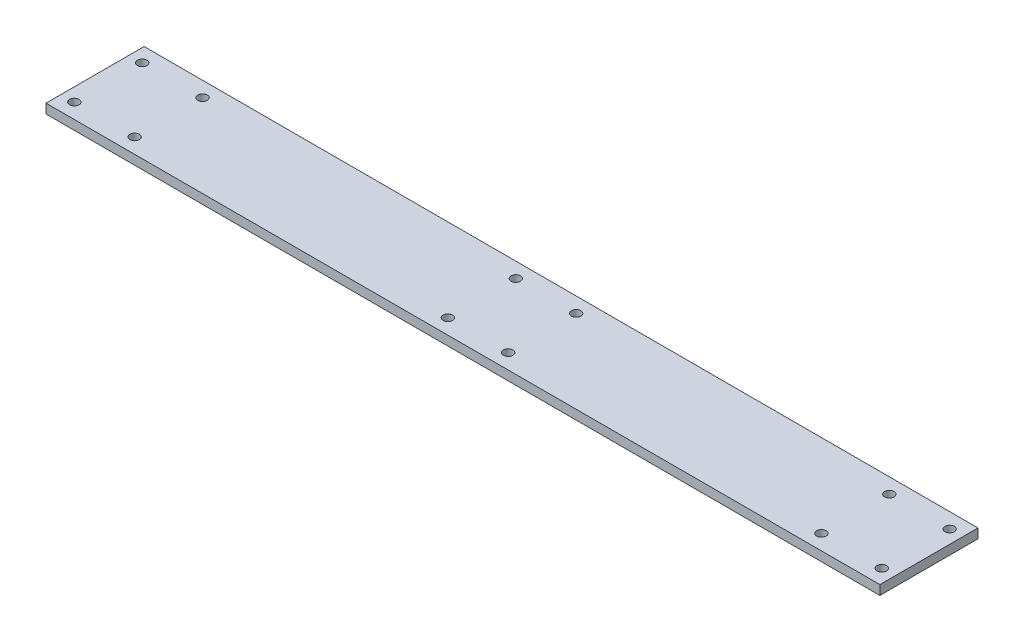
ISO-10303-21;
HEADER;
FILE_DESCRIPTION(('STEP AP214'),'2;1');
FILE_NAME('part.step','',(''),(''),'','','');
FILE_SCHEMA(('AUTOMOTIVE_DESIGN { 1 0 10303 214 1 1 1 1 }'));
ENDSEC;
DATA;
#1=APPLICATION_CONTEXT('core data for automotive mechanical design processes');
#2=APPLICATION_PROTOCOL_DEFINITION('international standard','automotive_design',2000,#1);
#3=PRODUCT_CONTEXT('',#1,'mechanical');
#4=PRODUCT('Part','Part','',(#3));
#5=PRODUCT_RELATED_PRODUCT_CATEGORY('part','',(#4));
#6=PRODUCT_DEFINITION_FORMATION('','',#4);
#7=PRODUCT_DEFINITION_CONTEXT('part definition',#1,'design');
#8=PRODUCT_DEFINITION('design','',#6,#7);
#9=PRODUCT_DEFINITION_SHAPE('','',#8);
#10=(LENGTH_UNIT() NAMED_UNIT(*) SI_UNIT(.MILLI.,.METRE.));
#11=(NAMED_UNIT(*) PLANE_ANGLE_UNIT() SI_UNIT($,.RADIAN.));
#12=(NAMED_UNIT(*) SI_UNIT($,.STERADIAN.) SOLID_ANGLE_UNIT());
#13=UNCERTAINTY_MEASURE_WITH_UNIT(LENGTH_MEASURE(1.E-05),#10,'distance_accuracy_value','');
#14=(GEOMETRIC_REPRESENTATION_CONTEXT(3) GLOBAL_UNCERTAINTY_ASSIGNED_CONTEXT((#13)) GLOBAL_UNIT_ASSIGNED_CONTEXT((#10,
#11,#12)) REPRESENTATION_CONTEXT('',''));
#15=CARTESIAN_POINT('',(0.,0.,0.));
#16=DIRECTION('',(0.,0.,1.));
#17=DIRECTION('',(1.,0.,0.));
#18=AXIS2_PLACEMENT_3D('',#15,#16,#17);
#19=CARTESIAN_POINT('',(0.,5.,0.));
#20=DIRECTION('',(1.,0.,0.));
#21=DIRECTION('',(0.,0.,-1.));
#22=AXIS2_PLACEMENT_3D('',#19,#20,#21);
#23=PLANE('',#22);
#24=DIRECTION('',(0.,0.,1.));
#25=VECTOR('',#24,1.);
#26=CARTESIAN_POINT('',(0.,0.,0.));
#27=LINE('',#26,#25);
#28=CARTESIAN_POINT('',(0.,0.,-52.));
#29=VERTEX_POINT('',#28);
#30=CARTESIAN_POINT('',(0.,0.,0.));
#31=VERTEX_POINT('',#30);
#32=EDGE_CURVE('E98',#29,#31,#27,.T.);
#33=ORIENTED_EDGE('',*,*,#32,.T.);
#34=DIRECTION('',(0.,-1.,0.));
#35=VECTOR('',#34,1.);
#36=CARTESIAN_POINT('',(0.,5.,0.));
#37=LINE('',#36,#35);
#38=CARTESIAN_POINT('',(0.,5.,0.));
#39=VERTEX_POINT('',#38);
#40=EDGE_CURVE('E11',#39,#31,#37,.T.);
#41=ORIENTED_EDGE('',*,*,#40,.F.);
#42=DIRECTION('',(0.,0.,1.));
#43=VECTOR('',#42,1.);
#44=CARTESIAN_POINT('',(0.,5.,0.));
#45=LINE('',#44,#43);
#46=CARTESIAN_POINT('',(0.,5.,-52.));
#47=VERTEX_POINT('',#46);
#48=EDGE_CURVE('E86',#47,#39,#45,.T.);
#49=ORIENTED_EDGE('',*,*,#48,.F.);
#50=DIRECTION('',(0.,-1.,0.));
#51=VECTOR('',#50,1.);
#52=CARTESIAN_POINT('',(0.,5.,-52.));
#53=LINE('',#52,#51);
#54=EDGE_CURVE('E94',#47,#29,#53,.T.);
#55=ORIENTED_EDGE('',*,*,#54,.T.);
#56=EDGE_LOOP('',(#33,#41,#49,#55));
#57=FACE_BOUND('',#56,.T.);
#58=ADVANCED_FACE('F35',(#57),#23,.F.);
#59=CARTESIAN_POINT('',(0.,5.,0.));
#60=DIRECTION('',(0.,0.,-1.));
#61=DIRECTION('',(-1.,0.,0.));
#62=AXIS2_PLACEMENT_3D('',#59,#60,#61);
#63=PLANE('',#62);
#64=DIRECTION('',(1.,0.,0.));
#65=VECTOR('',#64,1.);
#66=CARTESIAN_POINT('',(0.,0.,0.));
#67=LINE('',#66,#65);
#68=CARTESIAN_POINT('',(442.,0.,0.));
#69=VERTEX_POINT('',#68);
#70=EDGE_CURVE('E90',#31,#69,#67,.T.);
#71=ORIENTED_EDGE('',*,*,#70,.T.);
#72=DIRECTION('',(0.,-1.,0.));
#73=VECTOR('',#72,1.);
#74=CARTESIAN_POINT('',(442.,5.,0.));
#75=LINE('',#74,#73);
#76=CARTESIAN_POINT('',(442.,5.,0.));
#77=VERTEX_POINT('',#76);
#78=EDGE_CURVE('E43',#77,#69,#75,.T.);
#79=ORIENTED_EDGE('',*,*,#78,.F.);
#80=DIRECTION('',(1.,0.,0.));
#81=VECTOR('',#80,1.);
#82=CARTESIAN_POINT('',(0.,5.,0.));
#83=LINE('',#82,#81);
#84=EDGE_CURVE('E81',#39,#77,#83,.T.);
#85=ORIENTED_EDGE('',*,*,#84,.F.);
#86=ORIENTED_EDGE('',*,*,#40,.T.);
#87=EDGE_LOOP('',(#71,#79,#85,#86));
#88=FACE_BOUND('',#87,.T.);
#89=ADVANCED_FACE('F89',(#88),#63,.F.);
#90=CARTESIAN_POINT('',(442.,5.,0.));
#91=DIRECTION('',(-1.,0.,0.));
#92=DIRECTION('',(0.,0.,1.));
#93=AXIS2_PLACEMENT_3D('',#90,#91,#92);
#94=PLANE('',#93);
#95=DIRECTION('',(0.,0.,-1.));
#96=VECTOR('',#95,1.);
#97=CARTESIAN_POINT('',(442.,0.,0.));
#98=LINE('',#97,#96);
#99=CARTESIAN_POINT('',(442.,0.,-52.));
#100=VERTEX_POINT('',#99);
#101=EDGE_CURVE('E68',#69,#100,#98,.T.);
#102=ORIENTED_EDGE('',*,*,#101,.T.);
#103=DIRECTION('',(0.,-1.,0.));
#104=VECTOR('',#103,1.);
#105=CARTESIAN_POINT('',(442.,5.,-52.));
#106=LINE('',#105,#104);
#107=CARTESIAN_POINT('',(442.,5.,-52.));
#108=VERTEX_POINT('',#107);
#109=EDGE_CURVE('E91',#108,#100,#106,.T.);
#110=ORIENTED_EDGE('',*,*,#109,.F.);
#111=DIRECTION('',(0.,0.,-1.));
#112=VECTOR('',#111,1.);
#113=CARTESIAN_POINT('',(442.,5.,0.));
#114=LINE('',#113,#112);
#115=EDGE_CURVE('E84',#77,#108,#114,.T.);
#116=ORIENTED_EDGE('',*,*,#115,.F.);
#117=ORIENTED_EDGE('',*,*,#78,.T.);
#118=EDGE_LOOP('',(#102,#110,#116,#117));
#119=FACE_BOUND('',#118,.T.);
#120=ADVANCED_FACE('F92',(#119),#94,.F.);
#121=CARTESIAN_POINT('',(0.,5.,-52.));
#122=DIRECTION('',(0.,0.,1.));
#123=DIRECTION('',(1.,0.,0.));
#124=AXIS2_PLACEMENT_3D('',#121,#122,#123);
#125=PLANE('',#124);
#126=DIRECTION('',(-1.,0.,0.));
#127=VECTOR('',#126,1.);
#128=CARTESIAN_POINT('',(0.,0.,-52.));
#129=LINE('',#128,#127);
#130=EDGE_CURVE('E74',#100,#29,#129,.T.);
#131=ORIENTED_EDGE('',*,*,#130,.T.);
#132=ORIENTED_EDGE('',*,*,#54,.F.);
#133=DIRECTION('',(-1.,0.,0.));
#134=VECTOR('',#133,1.);
#135=CARTESIAN_POINT('',(0.,5.,-52.));
#136=LINE('',#135,#134);
#137=EDGE_CURVE('E51',#108,#47,#136,.T.);
#138=ORIENTED_EDGE('',*,*,#137,.F.);
#139=ORIENTED_EDGE('',*,*,#109,.T.);
#140=EDGE_LOOP('',(#131,#132,#138,#139));
#141=FACE_BOUND('',#140,.T.);
#142=ADVANCED_FACE('F106',(#141),#125,.F.);
#143=CARTESIAN_POINT('',(0.,5.,0.));
#144=DIRECTION('',(0.,-1.,0.));
#145=DIRECTION('',(0.,0.,-1.));
#146=AXIS2_PLACEMENT_3D('',#143,#144,#145);
#147=PLANE('',#146);
#148=CARTESIAN_POINT('',(39.,5.,-44.));
#149=DIRECTION('',(0.,1.,0.));
#150=DIRECTION('',(0.,0.,1.));
#151=AXIS2_PLACEMENT_3D('',#148,#149,#150);
#152=CIRCLE('',#151,2.5);
#153=CARTESIAN_POINT('',(39.,5.,-41.5));
#154=VERTEX_POINT('',#153);
#155=EDGE_CURVE('E178',#154,#154,#152,.T.);
#156=ORIENTED_EDGE('',*,*,#155,.F.);
#157=EDGE_LOOP('',(#156));
#158=FACE_BOUND('',#157,.T.);
#159=CARTESIAN_POINT('',(7.00000000000001,5.,-44.));
#160=DIRECTION('',(0.,1.,0.));
#161=DIRECTION('',(0.,0.,-1.));
#162=AXIS2_PLACEMENT_3D('',#159,#160,#161);
#163=CIRCLE('',#162,2.5);
#164=CARTESIAN_POINT('',(7.00000000000001,5.,-46.5));
#165=VERTEX_POINT('',#164);
#166=EDGE_CURVE('E172',#165,#165,#163,.T.);
#167=ORIENTED_EDGE('',*,*,#166,.F.);
#168=EDGE_LOOP('',(#167));
#169=FACE_BOUND('',#168,.T.);
#170=CARTESIAN_POINT('',(39.,5.,-8.00000000000002));
#171=DIRECTION('',(0.,1.,0.));
#172=DIRECTION('',(0.,0.,-1.));
#173=AXIS2_PLACEMENT_3D('',#170,#171,#172);
#174=CIRCLE('',#173,2.5);
#175=CARTESIAN_POINT('',(39.,5.,-10.5));
#176=VERTEX_POINT('',#175);
#177=EDGE_CURVE('E166',#176,#176,#174,.T.);
#178=ORIENTED_EDGE('',*,*,#177,.F.);
#179=EDGE_LOOP('',(#178));
#180=FACE_BOUND('',#179,.T.);
#181=CARTESIAN_POINT('',(7.00000000000001,5.,-8.00000000000002));
#182=DIRECTION('',(0.,1.,0.));
#183=DIRECTION('',(0.,0.,1.));
#184=AXIS2_PLACEMENT_3D('',#181,#182,#183);
#185=CIRCLE('',#184,2.5);
#186=CARTESIAN_POINT('',(7.00000000000001,5.,-5.50000000000003));
#187=VERTEX_POINT('',#186);
#188=EDGE_CURVE('E160',#187,#187,#185,.T.);
#189=ORIENTED_EDGE('',*,*,#188,.F.);
#190=EDGE_LOOP('',(#189));
#191=FACE_BOUND('',#190,.T.);
#192=CARTESIAN_POINT('',(435.,5.,-44.));
#193=DIRECTION('',(0.,1.,0.));
#194=DIRECTION('',(0.,0.,1.));
#195=AXIS2_PLACEMENT_3D('',#192,#193,#194);
#196=CIRCLE('',#195,2.49999999999997);
#197=CARTESIAN_POINT('',(435.,5.,-41.5));
#198=VERTEX_POINT('',#197);
#199=EDGE_CURVE('E154',#198,#198,#196,.T.);
#200=ORIENTED_EDGE('',*,*,#199,.F.);
#201=EDGE_LOOP('',(#200));
#202=FACE_BOUND('',#201,.T.);
#203=CARTESIAN_POINT('',(403.,5.,-44.));
#204=DIRECTION('',(0.,1.,0.));
#205=DIRECTION('',(0.,0.,-1.));
#206=AXIS2_PLACEMENT_3D('',#203,#204,#205);
#207=CIRCLE('',#206,2.50000000000002);
#208=CARTESIAN_POINT('',(403.,5.,-46.5));
#209=VERTEX_POINT('',#208);
#210=EDGE_CURVE('E148',#209,#209,#207,.T.);
#211=ORIENTED_EDGE('',*,*,#210,.F.);
#212=EDGE_LOOP('',(#211));
#213=FACE_BOUND('',#212,.T.);
#214=CARTESIAN_POINT('',(435.,5.,-8.00000000000002));
#215=DIRECTION('',(0.,1.,0.));
#216=DIRECTION('',(0.,0.,-1.));
#217=AXIS2_PLACEMENT_3D('',#214,#215,#216);
#218=CIRCLE('',#217,2.49999999999997);
#219=CARTESIAN_POINT('',(435.,5.,-10.5));
#220=VERTEX_POINT('',#219);
#221=EDGE_CURVE('E142',#220,#220,#218,.T.);
#222=ORIENTED_EDGE('',*,*,#221,.F.);
#223=EDGE_LOOP('',(#222));
#224=FACE_BOUND('',#223,.T.);
#225=CARTESIAN_POINT('',(403.,5.,-8.00000000000002));
#226=DIRECTION('',(0.,1.,0.));
#227=DIRECTION('',(0.,0.,1.));
#228=AXIS2_PLACEMENT_3D('',#225,#226,#227);
#229=CIRCLE('',#228,2.50000000000002);
#230=CARTESIAN_POINT('',(403.,5.,-5.5));
#231=VERTEX_POINT('',#230);
#232=EDGE_CURVE('E136',#231,#231,#229,.T.);
#233=ORIENTED_EDGE('',*,*,#232,.F.);
#234=EDGE_LOOP('',(#233));
#235=FACE_BOUND('',#234,.T.);
#236=CARTESIAN_POINT('',(237.,5.,-44.));
#237=DIRECTION('',(0.,1.,0.));
#238=DIRECTION('',(0.,0.,1.));
#239=AXIS2_PLACEMENT_3D('',#236,#237,#238);
#240=CIRCLE('',#239,2.5);
#241=CARTESIAN_POINT('',(237.,5.,-41.5));
#242=VERTEX_POINT('',#241);
#243=EDGE_CURVE('E130',#242,#242,#240,.T.);
#244=ORIENTED_EDGE('',*,*,#243,.F.);
#245=EDGE_LOOP('',(#244));
#246=FACE_BOUND('',#245,.T.);
#247=CARTESIAN_POINT('',(205.,5.,-44.));
#248=DIRECTION('',(0.,1.,0.));
#249=DIRECTION('',(0.,0.,-1.));
#250=AXIS2_PLACEMENT_3D('',#247,#248,#249);
#251=CIRCLE('',#250,2.5);
#252=CARTESIAN_POINT('',(205.,5.,-46.5));
#253=VERTEX_POINT('',#252);
#254=EDGE_CURVE('E124',#253,#253,#251,.T.);
#255=ORIENTED_EDGE('',*,*,#254,.F.);
#256=EDGE_LOOP('',(#255));
#257=FACE_BOUND('',#256,.T.);
#258=CARTESIAN_POINT('',(237.,5.,-8.00000000000001));
#259=DIRECTION('',(0.,1.,0.));
#260=DIRECTION('',(0.,0.,-1.));
#261=AXIS2_PLACEMENT_3D('',#258,#259,#260);
#262=CIRCLE('',#261,2.5);
#263=CARTESIAN_POINT('',(237.,5.,-10.5));
#264=VERTEX_POINT('',#263);
#265=EDGE_CURVE('E118',#264,#264,#262,.T.);
#266=ORIENTED_EDGE('',*,*,#265,.F.);
#267=EDGE_LOOP('',(#266));
#268=FACE_BOUND('',#267,.T.);
#269=CARTESIAN_POINT('',(205.,5.,-8.00000000000001));
#270=DIRECTION('',(0.,1.,0.));
#271=DIRECTION('',(0.,0.,1.));
#272=AXIS2_PLACEMENT_3D('',#269,#270,#271);
#273=CIRCLE('',#272,2.5);
#274=CARTESIAN_POINT('',(205.,5.,-5.50000000000002));
#275=VERTEX_POINT('',#274);
#276=EDGE_CURVE('E112',#275,#275,#273,.T.);
#277=ORIENTED_EDGE('',*,*,#276,.F.);
#278=EDGE_LOOP('',(#277));
#279=FACE_BOUND('',#278,.T.);
#280=ORIENTED_EDGE('',*,*,#48,.T.);
#281=ORIENTED_EDGE('',*,*,#84,.T.);
#282=ORIENTED_EDGE('',*,*,#115,.T.);
#283=ORIENTED_EDGE('',*,*,#137,.T.);
#284=EDGE_LOOP('',(#280,#281,#282,#283));
#285=FACE_BOUND('',#284,.T.);
#286=ADVANCED_FACE('F82',(#158,#169,#180,#191,#202,#213,#224,#235,#246,#257,#268,#279,#285),
#147,.F.);
#287=CARTESIAN_POINT('',(0.,0.,0.));
#288=DIRECTION('',(0.,-1.,0.));
#289=DIRECTION('',(0.,0.,-1.));
#290=AXIS2_PLACEMENT_3D('',#287,#288,#289);
#291=PLANE('',#290);
#292=CARTESIAN_POINT('',(39.,0.,-44.));
#293=DIRECTION('',(0.,1.,0.));
#294=DIRECTION('',(0.,0.,1.));
#295=AXIS2_PLACEMENT_3D('',#292,#293,#294);
#296=CIRCLE('',#295,2.5);
#297=CARTESIAN_POINT('',(39.,0.,-41.5));
#298=VERTEX_POINT('',#297);
#299=EDGE_CURVE('E175',#298,#298,#296,.T.);
#300=ORIENTED_EDGE('',*,*,#299,.T.);
#301=EDGE_LOOP('',(#300));
#302=FACE_BOUND('',#301,.T.);
#303=CARTESIAN_POINT('',(7.00000000000001,0.,-44.));
#304=DIRECTION('',(0.,1.,0.));
#305=DIRECTION('',(0.,0.,-1.));
#306=AXIS2_PLACEMENT_3D('',#303,#304,#305);
#307=CIRCLE('',#306,2.5);
#308=CARTESIAN_POINT('',(7.00000000000001,0.,-46.5));
#309=VERTEX_POINT('',#308);
#310=EDGE_CURVE('E169',#309,#309,#307,.T.);
#311=ORIENTED_EDGE('',*,*,#310,.T.);
#312=EDGE_LOOP('',(#311));
#313=FACE_BOUND('',#312,.T.);
#314=CARTESIAN_POINT('',(39.,0.,-8.00000000000002));
#315=DIRECTION('',(0.,1.,0.));
#316=DIRECTION('',(0.,0.,-1.));
#317=AXIS2_PLACEMENT_3D('',#314,#315,#316);
#318=CIRCLE('',#317,2.5);
#319=CARTESIAN_POINT('',(39.,0.,-10.5));
#320=VERTEX_POINT('',#319);
#321=EDGE_CURVE('E163',#320,#320,#318,.T.);
#322=ORIENTED_EDGE('',*,*,#321,.T.);
#323=EDGE_LOOP('',(#322));
#324=FACE_BOUND('',#323,.T.);
#325=CARTESIAN_POINT('',(7.00000000000001,0.,-8.00000000000002));
#326=DIRECTION('',(0.,1.,0.));
#327=DIRECTION('',(0.,0.,1.));
#328=AXIS2_PLACEMENT_3D('',#325,#326,#327);
#329=CIRCLE('',#328,2.5);
#330=CARTESIAN_POINT('',(7.00000000000001,0.,-5.50000000000003));
#331=VERTEX_POINT('',#330);
#332=EDGE_CURVE('E157',#331,#331,#329,.T.);
#333=ORIENTED_EDGE('',*,*,#332,.T.);
#334=EDGE_LOOP('',(#333));
#335=FACE_BOUND('',#334,.T.);
#336=CARTESIAN_POINT('',(435.,0.,-44.));
#337=DIRECTION('',(0.,1.,0.));
#338=DIRECTION('',(0.,0.,1.));
#339=AXIS2_PLACEMENT_3D('',#336,#337,#338);
#340=CIRCLE('',#339,2.49999999999997);
#341=CARTESIAN_POINT('',(435.,0.,-41.5));
#342=VERTEX_POINT('',#341);
#343=EDGE_CURVE('E151',#342,#342,#340,.T.);
#344=ORIENTED_EDGE('',*,*,#343,.T.);
#345=EDGE_LOOP('',(#344));
#346=FACE_BOUND('',#345,.T.);
#347=CARTESIAN_POINT('',(403.,0.,-44.));
#348=DIRECTION('',(0.,1.,0.));
#349=DIRECTION('',(0.,0.,-1.));
#350=AXIS2_PLACEMENT_3D('',#347,#348,#349);
#351=CIRCLE('',#350,2.50000000000002);
#352=CARTESIAN_POINT('',(403.,0.,-46.5));
#353=VERTEX_POINT('',#352);
#354=EDGE_CURVE('E145',#353,#353,#351,.T.);
#355=ORIENTED_EDGE('',*,*,#354,.T.);
#356=EDGE_LOOP('',(#355));
#357=FACE_BOUND('',#356,.T.);
#358=CARTESIAN_POINT('',(435.,0.,-8.00000000000002));
#359=DIRECTION('',(0.,1.,0.));
#360=DIRECTION('',(0.,0.,-1.));
#361=AXIS2_PLACEMENT_3D('',#358,#359,#360);
#362=CIRCLE('',#361,2.49999999999997);
#363=CARTESIAN_POINT('',(435.,0.,-10.5));
#364=VERTEX_POINT('',#363);
#365=EDGE_CURVE('E139',#364,#364,#362,.T.);
#366=ORIENTED_EDGE('',*,*,#365,.T.);
#367=EDGE_LOOP('',(#366));
#368=FACE_BOUND('',#367,.T.);
#369=CARTESIAN_POINT('',(403.,0.,-8.00000000000002));
#370=DIRECTION('',(0.,1.,0.));
#371=DIRECTION('',(0.,0.,1.));
#372=AXIS2_PLACEMENT_3D('',#369,#370,#371);
#373=CIRCLE('',#372,2.50000000000002);
#374=CARTESIAN_POINT('',(403.,0.,-5.5));
#375=VERTEX_POINT('',#374);
#376=EDGE_CURVE('E133',#375,#375,#373,.T.);
#377=ORIENTED_EDGE('',*,*,#376,.T.);
#378=EDGE_LOOP('',(#377));
#379=FACE_BOUND('',#378,.T.);
#380=CARTESIAN_POINT('',(237.,0.,-44.));
#381=DIRECTION('',(0.,1.,0.));
#382=DIRECTION('',(0.,0.,1.));
#383=AXIS2_PLACEMENT_3D('',#380,#381,#382);
#384=CIRCLE('',#383,2.5);
#385=CARTESIAN_POINT('',(237.,0.,-41.5));
#386=VERTEX_POINT('',#385);
#387=EDGE_CURVE('E127',#386,#386,#384,.T.);
#388=ORIENTED_EDGE('',*,*,#387,.T.);
#389=EDGE_LOOP('',(#388));
#390=FACE_BOUND('',#389,.T.);
#391=CARTESIAN_POINT('',(205.,0.,-44.));
#392=DIRECTION('',(0.,1.,0.));
#393=DIRECTION('',(0.,0.,-1.));
#394=AXIS2_PLACEMENT_3D('',#391,#392,#393);
#395=CIRCLE('',#394,2.5);
#396=CARTESIAN_POINT('',(205.,0.,-46.5));
#397=VERTEX_POINT('',#396);
#398=EDGE_CURVE('E121',#397,#397,#395,.T.);
#399=ORIENTED_EDGE('',*,*,#398,.T.);
#400=EDGE_LOOP('',(#399));
#401=FACE_BOUND('',#400,.T.);
#402=CARTESIAN_POINT('',(237.,0.,-8.00000000000001));
#403=DIRECTION('',(0.,1.,0.));
#404=DIRECTION('',(0.,0.,-1.));
#405=AXIS2_PLACEMENT_3D('',#402,#403,#404);
#406=CIRCLE('',#405,2.5);
#407=CARTESIAN_POINT('',(237.,0.,-10.5));
#408=VERTEX_POINT('',#407);
#409=EDGE_CURVE('E115',#408,#408,#406,.T.);
#410=ORIENTED_EDGE('',*,*,#409,.T.);
#411=EDGE_LOOP('',(#410));
#412=FACE_BOUND('',#411,.T.);
#413=CARTESIAN_POINT('',(205.,0.,-8.00000000000001));
#414=DIRECTION('',(0.,1.,0.));
#415=DIRECTION('',(0.,0.,1.));
#416=AXIS2_PLACEMENT_3D('',#413,#414,#415);
#417=CIRCLE('',#416,2.5);
#418=CARTESIAN_POINT('',(205.,0.,-5.50000000000002));
#419=VERTEX_POINT('',#418);
#420=EDGE_CURVE('E101',#419,#419,#417,.T.);
#421=ORIENTED_EDGE('',*,*,#420,.T.);
#422=EDGE_LOOP('',(#421));
#423=FACE_BOUND('',#422,.T.);
#424=ORIENTED_EDGE('',*,*,#32,.F.);
#425=ORIENTED_EDGE('',*,*,#130,.F.);
#426=ORIENTED_EDGE('',*,*,#101,.F.);
#427=ORIENTED_EDGE('',*,*,#70,.F.);
#428=EDGE_LOOP('',(#424,#425,#426,#427));
#429=FACE_BOUND('',#428,.T.);
#430=ADVANCED_FACE('F109',(#302,#313,#324,#335,#346,#357,#368,#379,#390,#401,#412,#423,#429),
#291,.T.);
#431=CARTESIAN_POINT('',(205.,0.,-8.00000000000001));
#432=DIRECTION('',(0.,1.,0.));
#433=DIRECTION('',(0.,0.,1.));
#434=AXIS2_PLACEMENT_3D('',#431,#432,#433);
#435=CYLINDRICAL_SURFACE('',#434,2.5);
#436=ORIENTED_EDGE('',*,*,#420,.F.);
#437=EDGE_LOOP('',(#436));
#438=FACE_BOUND('',#437,.T.);
#439=ORIENTED_EDGE('',*,*,#276,.T.);
#440=EDGE_LOOP('',(#439));
#441=FACE_BOUND('',#440,.T.);
#442=ADVANCED_FACE('F218',(#438,#441),#435,.F.);
#443=CARTESIAN_POINT('',(237.,0.,-8.00000000000001));
#444=DIRECTION('',(0.,1.,0.));
#445=DIRECTION('',(0.,0.,1.));
#446=AXIS2_PLACEMENT_3D('',#443,#444,#445);
#447=CYLINDRICAL_SURFACE('',#446,2.5);
#448=ORIENTED_EDGE('',*,*,#409,.F.);
#449=EDGE_LOOP('',(#448));
#450=FACE_BOUND('',#449,.T.);
#451=ORIENTED_EDGE('',*,*,#265,.T.);
#452=EDGE_LOOP('',(#451));
#453=FACE_BOUND('',#452,.T.);
#454=ADVANCED_FACE('F220',(#450,#453),#447,.F.);
#455=CARTESIAN_POINT('',(205.,0.,-44.));
#456=DIRECTION('',(0.,1.,0.));
#457=DIRECTION('',(0.,0.,1.));
#458=AXIS2_PLACEMENT_3D('',#455,#456,#457);
#459=CYLINDRICAL_SURFACE('',#458,2.5);
#460=ORIENTED_EDGE('',*,*,#398,.F.);
#461=EDGE_LOOP('',(#460));
#462=FACE_BOUND('',#461,.T.);
#463=ORIENTED_EDGE('',*,*,#254,.T.);
#464=EDGE_LOOP('',(#463));
#465=FACE_BOUND('',#464,.T.);
#466=ADVANCED_FACE('F227',(#462,#465),#459,.F.);
#467=CARTESIAN_POINT('',(237.,0.,-44.));
#468=DIRECTION('',(0.,1.,0.));
#469=DIRECTION('',(0.,0.,1.));
#470=AXIS2_PLACEMENT_3D('',#467,#468,#469);
#471=CYLINDRICAL_SURFACE('',#470,2.5);
#472=ORIENTED_EDGE('',*,*,#387,.F.);
#473=EDGE_LOOP('',(#472));
#474=FACE_BOUND('',#473,.T.);
#475=ORIENTED_EDGE('',*,*,#243,.T.);
#476=EDGE_LOOP('',(#475));
#477=FACE_BOUND('',#476,.T.);
#478=ADVANCED_FACE('F273',(#474,#477),#471,.F.);
#479=CARTESIAN_POINT('',(403.,0.,-8.00000000000002));
#480=DIRECTION('',(0.,1.,0.));
#481=DIRECTION('',(0.,0.,1.));
#482=AXIS2_PLACEMENT_3D('',#479,#480,#481);
#483=CYLINDRICAL_SURFACE('',#482,2.50000000000002);
#484=ORIENTED_EDGE('',*,*,#376,.F.);
#485=EDGE_LOOP('',(#484));
#486=FACE_BOUND('',#485,.T.);
#487=ORIENTED_EDGE('',*,*,#232,.T.);
#488=EDGE_LOOP('',(#487));
#489=FACE_BOUND('',#488,.T.);
#490=ADVANCED_FACE('F283',(#486,#489),#483,.F.);
#491=CARTESIAN_POINT('',(435.,0.,-8.00000000000002));
#492=DIRECTION('',(0.,1.,0.));
#493=DIRECTION('',(0.,0.,1.));
#494=AXIS2_PLACEMENT_3D('',#491,#492,#493);
#495=CYLINDRICAL_SURFACE('',#494,2.49999999999997);
#496=ORIENTED_EDGE('',*,*,#365,.F.);
#497=EDGE_LOOP('',(#496));
#498=FACE_BOUND('',#497,.T.);
#499=ORIENTED_EDGE('',*,*,#221,.T.);
#500=EDGE_LOOP('',(#499));
#501=FACE_BOUND('',#500,.T.);
#502=ADVANCED_FACE('F293',(#498,#501),#495,.F.);
#503=CARTESIAN_POINT('',(403.,0.,-44.));
#504=DIRECTION('',(0.,1.,0.));
#505=DIRECTION('',(0.,0.,1.));
#506=AXIS2_PLACEMENT_3D('',#503,#504,#505);
#507=CYLINDRICAL_SURFACE('',#506,2.50000000000002);
#508=ORIENTED_EDGE('',*,*,#354,.F.);
#509=EDGE_LOOP('',(#508));
#510=FACE_BOUND('',#509,.T.);
#511=ORIENTED_EDGE('',*,*,#210,.T.);
#512=EDGE_LOOP('',(#511));
#513=FACE_BOUND('',#512,.T.);
#514=ADVANCED_FACE('F303',(#510,#513),#507,.F.);
#515=CARTESIAN_POINT('',(435.,0.,-44.));
#516=DIRECTION('',(0.,1.,0.));
#517=DIRECTION('',(0.,0.,1.));
#518=AXIS2_PLACEMENT_3D('',#515,#516,#517);
#519=CYLINDRICAL_SURFACE('',#518,2.49999999999997);
#520=ORIENTED_EDGE('',*,*,#343,.F.);
#521=EDGE_LOOP('',(#520));
#522=FACE_BOUND('',#521,.T.);
#523=ORIENTED_EDGE('',*,*,#199,.T.);
#524=EDGE_LOOP('',(#523));
#525=FACE_BOUND('',#524,.T.);
#526=ADVANCED_FACE('F313',(#522,#525),#519,.F.);
#527=CARTESIAN_POINT('',(7.00000000000001,0.,-8.00000000000002));
#528=DIRECTION('',(0.,1.,0.));
#529=DIRECTION('',(0.,0.,1.));
#530=AXIS2_PLACEMENT_3D('',#527,#528,#529);
#531=CYLINDRICAL_SURFACE('',#530,2.5);
#532=ORIENTED_EDGE('',*,*,#332,.F.);
#533=EDGE_LOOP('',(#532));
#534=FACE_BOUND('',#533,.T.);
#535=ORIENTED_EDGE('',*,*,#188,.T.);
#536=EDGE_LOOP('',(#535));
#537=FACE_BOUND('',#536,.T.);
#538=ADVANCED_FACE('F323',(#534,#537),#531,.F.);
#539=CARTESIAN_POINT('',(39.,0.,-8.00000000000002));
#540=DIRECTION('',(0.,1.,0.));
#541=DIRECTION('',(0.,0.,1.));
#542=AXIS2_PLACEMENT_3D('',#539,#540,#541);
#543=CYLINDRICAL_SURFACE('',#542,2.5);
#544=ORIENTED_EDGE('',*,*,#321,.F.);
#545=EDGE_LOOP('',(#544));
#546=FACE_BOUND('',#545,.T.);
#547=ORIENTED_EDGE('',*,*,#177,.T.);
#548=EDGE_LOOP('',(#547));
#549=FACE_BOUND('',#548,.T.);
#550=ADVANCED_FACE('F333',(#546,#549),#543,.F.);
#551=CARTESIAN_POINT('',(7.00000000000001,0.,-44.));
#552=DIRECTION('',(0.,1.,0.));
#553=DIRECTION('',(0.,0.,1.));
#554=AXIS2_PLACEMENT_3D('',#551,#552,#553);
#555=CYLINDRICAL_SURFACE('',#554,2.5);
#556=ORIENTED_EDGE('',*,*,#310,.F.);
#557=EDGE_LOOP('',(#556));
#558=FACE_BOUND('',#557,.T.);
#559=ORIENTED_EDGE('',*,*,#166,.T.);
#560=EDGE_LOOP('',(#559));
#561=FACE_BOUND('',#560,.T.);
#562=ADVANCED_FACE('F189',(#558,#561),#555,.F.);
#563=CARTESIAN_POINT('',(39.,0.,-44.));
#564=DIRECTION('',(0.,1.,0.));
#565=DIRECTION('',(0.,0.,1.));
#566=AXIS2_PLACEMENT_3D('',#563,#564,#565);
#567=CYLINDRICAL_SURFACE('',#566,2.5);
#568=ORIENTED_EDGE('',*,*,#299,.F.);
#569=EDGE_LOOP('',(#568));
#570=FACE_BOUND('',#569,.T.);
#571=ORIENTED_EDGE('',*,*,#155,.T.);
#572=EDGE_LOOP('',(#571));
#573=FACE_BOUND('',#572,.T.);
#574=ADVANCED_FACE('F186',(#570,#573),#567,.F.);
#575=CLOSED_SHELL('',(#58,#89,#120,#142,#286,#430,#442,#454,#466,#478,#490,#502,#514,#526,#538,
#550,#562,#574));
#576=MANIFOLD_SOLID_BREP('B2',#575);
#577=ADVANCED_BREP_SHAPE_REPRESENTATION('',(#18,#576),#14);
#578=SHAPE_DEFINITION_REPRESENTATION(#9,#577);
ENDSEC;
END-ISO-10303-21;
